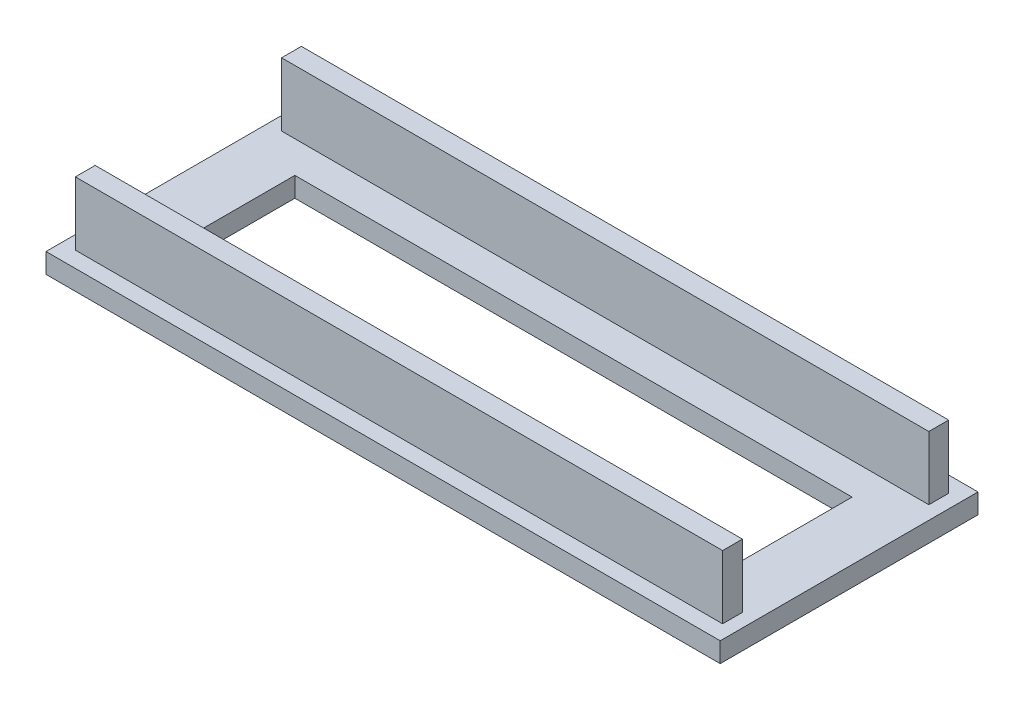
ISO-10303-21;
HEADER;
FILE_DESCRIPTION(('STEP AP214'),'2;1');
FILE_NAME('part.step','',(''),(''),'','','');
FILE_SCHEMA(('AUTOMOTIVE_DESIGN { 1 0 10303 214 1 1 1 1 }'));
ENDSEC;
DATA;
#1=APPLICATION_CONTEXT('core data for automotive mechanical design processes');
#2=APPLICATION_PROTOCOL_DEFINITION('international standard','automotive_design',2000,#1);
#3=PRODUCT_CONTEXT('',#1,'mechanical');
#4=PRODUCT('Part','Part','',(#3));
#5=PRODUCT_RELATED_PRODUCT_CATEGORY('part','',(#4));
#6=PRODUCT_DEFINITION_FORMATION('','',#4);
#7=PRODUCT_DEFINITION_CONTEXT('part definition',#1,'design');
#8=PRODUCT_DEFINITION('design','',#6,#7);
#9=PRODUCT_DEFINITION_SHAPE('','',#8);
#10=(LENGTH_UNIT() NAMED_UNIT(*) SI_UNIT(.MILLI.,.METRE.));
#11=(NAMED_UNIT(*) PLANE_ANGLE_UNIT() SI_UNIT($,.RADIAN.));
#12=(NAMED_UNIT(*) SI_UNIT($,.STERADIAN.) SOLID_ANGLE_UNIT());
#13=UNCERTAINTY_MEASURE_WITH_UNIT(LENGTH_MEASURE(1.E-05),#10,'distance_accuracy_value','');
#14=(GEOMETRIC_REPRESENTATION_CONTEXT(3) GLOBAL_UNCERTAINTY_ASSIGNED_CONTEXT((#13)) GLOBAL_UNIT_ASSIGNED_CONTEXT((#10,
#11,#12)) REPRESENTATION_CONTEXT('',''));
#15=CARTESIAN_POINT('',(0.,0.,0.));
#16=DIRECTION('',(0.,0.,1.));
#17=DIRECTION('',(1.,0.,0.));
#18=AXIS2_PLACEMENT_3D('',#15,#16,#17);
#19=CARTESIAN_POINT('',(0.,10.,0.));
#20=DIRECTION('',(0.,-1.,0.));
#21=DIRECTION('',(0.,0.,-1.));
#22=AXIS2_PLACEMENT_3D('',#19,#20,#21);
#23=PLANE('',#22);
#24=DIRECTION('',(0.,0.,-1.));
#25=VECTOR('',#24,1.);
#26=CARTESIAN_POINT('',(163.2,10.,0.));
#27=LINE('',#26,#25);
#28=CARTESIAN_POINT('',(163.2,10.,-47.));
#29=VERTEX_POINT('',#28);
#30=CARTESIAN_POINT('',(163.2,10.,-57.));
#31=VERTEX_POINT('',#30);
#32=EDGE_CURVE('E213',#29,#31,#27,.T.);
#33=ORIENTED_EDGE('',*,*,#32,.F.);
#34=DIRECTION('',(1.,0.,0.));
#35=VECTOR('',#34,1.);
#36=CARTESIAN_POINT('',(0.,10.,-47.));
#37=LINE('',#36,#35);
#38=CARTESIAN_POINT('',(-163.2,10.,-47.));
#39=VERTEX_POINT('',#38);
#40=EDGE_CURVE('E204',#39,#29,#37,.T.);
#41=ORIENTED_EDGE('',*,*,#40,.F.);
#42=DIRECTION('',(0.,0.,1.));
#43=VECTOR('',#42,1.);
#44=CARTESIAN_POINT('',(-163.2,10.,0.));
#45=LINE('',#44,#43);
#46=CARTESIAN_POINT('',(-163.2,10.,-57.));
#47=VERTEX_POINT('',#46);
#48=EDGE_CURVE('E207',#47,#39,#45,.T.);
#49=ORIENTED_EDGE('',*,*,#48,.F.);
#50=DIRECTION('',(-1.,0.,0.));
#51=VECTOR('',#50,1.);
#52=CARTESIAN_POINT('',(0.,10.,-57.));
#53=LINE('',#52,#51);
#54=EDGE_CURVE('E210',#31,#47,#53,.T.);
#55=ORIENTED_EDGE('',*,*,#54,.F.);
#56=EDGE_LOOP('',(#33,#41,#49,#55));
#57=FACE_BOUND('',#56,.T.);
#58=DIRECTION('',(0.,0.,-1.));
#59=VECTOR('',#58,1.);
#60=CARTESIAN_POINT('',(170.,10.,65.));
#61=LINE('',#60,#59);
#62=CARTESIAN_POINT('',(170.,10.,65.));
#63=VERTEX_POINT('',#62);
#64=CARTESIAN_POINT('',(170.,10.,-65.));
#65=VERTEX_POINT('',#64);
#66=EDGE_CURVE('E248',#63,#65,#61,.T.);
#67=ORIENTED_EDGE('',*,*,#66,.T.);
#68=DIRECTION('',(-1.,0.,0.));
#69=VECTOR('',#68,1.);
#70=CARTESIAN_POINT('',(-170.,10.,-65.));
#71=LINE('',#70,#69);
#72=CARTESIAN_POINT('',(-170.,10.,-65.));
#73=VERTEX_POINT('',#72);
#74=EDGE_CURVE('E251',#65,#73,#71,.T.);
#75=ORIENTED_EDGE('',*,*,#74,.T.);
#76=DIRECTION('',(0.,0.,1.));
#77=VECTOR('',#76,1.);
#78=CARTESIAN_POINT('',(-170.,10.,65.));
#79=LINE('',#78,#77);
#80=CARTESIAN_POINT('',(-170.,10.,65.));
#81=VERTEX_POINT('',#80);
#82=EDGE_CURVE('E254',#73,#81,#79,.T.);
#83=ORIENTED_EDGE('',*,*,#82,.T.);
#84=DIRECTION('',(1.,0.,0.));
#85=VECTOR('',#84,1.);
#86=CARTESIAN_POINT('',(-170.,10.,65.));
#87=LINE('',#86,#85);
#88=EDGE_CURVE('E256',#81,#63,#87,.T.);
#89=ORIENTED_EDGE('',*,*,#88,.T.);
#90=EDGE_LOOP('',(#67,#75,#83,#89));
#91=FACE_BOUND('',#90,.T.);
#92=DIRECTION('',(0.,0.,-1.));
#93=VECTOR('',#92,1.);
#94=CARTESIAN_POINT('',(140.5,10.,31.));
#95=LINE('',#94,#93);
#96=CARTESIAN_POINT('',(140.5,10.,31.));
#97=VERTEX_POINT('',#96);
#98=CARTESIAN_POINT('',(140.5,10.,-31.));
#99=VERTEX_POINT('',#98);
#100=EDGE_CURVE('E217',#97,#99,#95,.T.);
#101=ORIENTED_EDGE('',*,*,#100,.F.);
#102=DIRECTION('',(1.,0.,0.));
#103=VECTOR('',#102,1.);
#104=CARTESIAN_POINT('',(-140.5,10.,31.));
#105=LINE('',#104,#103);
#106=CARTESIAN_POINT('',(-140.5,10.,31.));
#107=VERTEX_POINT('',#106);
#108=EDGE_CURVE('E225',#107,#97,#105,.T.);
#109=ORIENTED_EDGE('',*,*,#108,.F.);
#110=DIRECTION('',(0.,0.,1.));
#111=VECTOR('',#110,1.);
#112=CARTESIAN_POINT('',(-140.5,10.,31.));
#113=LINE('',#112,#111);
#114=CARTESIAN_POINT('',(-140.5,10.,-31.));
#115=VERTEX_POINT('',#114);
#116=EDGE_CURVE('E222',#115,#107,#113,.T.);
#117=ORIENTED_EDGE('',*,*,#116,.F.);
#118=DIRECTION('',(-1.,0.,0.));
#119=VECTOR('',#118,1.);
#120=CARTESIAN_POINT('',(-140.5,10.,-31.));
#121=LINE('',#120,#119);
#122=EDGE_CURVE('E219',#99,#115,#121,.T.);
#123=ORIENTED_EDGE('',*,*,#122,.F.);
#124=EDGE_LOOP('',(#101,#109,#117,#123));
#125=FACE_BOUND('',#124,.T.);
#126=DIRECTION('',(0.,0.,-1.));
#127=VECTOR('',#126,1.);
#128=CARTESIAN_POINT('',(163.2,10.,0.));
#129=LINE('',#128,#127);
#130=CARTESIAN_POINT('',(163.2,10.,57.));
#131=VERTEX_POINT('',#130);
#132=CARTESIAN_POINT('',(163.2,10.,47.));
#133=VERTEX_POINT('',#132);
#134=EDGE_CURVE('E181',#131,#133,#129,.T.);
#135=ORIENTED_EDGE('',*,*,#134,.F.);
#136=DIRECTION('',(1.,0.,0.));
#137=VECTOR('',#136,1.);
#138=CARTESIAN_POINT('',(0.,10.,57.));
#139=LINE('',#138,#137);
#140=CARTESIAN_POINT('',(-163.2,10.,57.));
#141=VERTEX_POINT('',#140);
#142=EDGE_CURVE('E166',#141,#131,#139,.T.);
#143=ORIENTED_EDGE('',*,*,#142,.F.);
#144=DIRECTION('',(0.,0.,1.));
#145=VECTOR('',#144,1.);
#146=CARTESIAN_POINT('',(-163.2,10.,0.));
#147=LINE('',#146,#145);
#148=CARTESIAN_POINT('',(-163.2,10.,47.));
#149=VERTEX_POINT('',#148);
#150=EDGE_CURVE('E59',#149,#141,#147,.T.);
#151=ORIENTED_EDGE('',*,*,#150,.F.);
#152=DIRECTION('',(-1.,0.,0.));
#153=VECTOR('',#152,1.);
#154=CARTESIAN_POINT('',(0.,10.,47.));
#155=LINE('',#154,#153);
#156=EDGE_CURVE('E54',#133,#149,#155,.T.);
#157=ORIENTED_EDGE('',*,*,#156,.F.);
#158=EDGE_LOOP('',(#135,#143,#151,#157));
#159=FACE_BOUND('',#158,.T.);
#160=ADVANCED_FACE('F39',(#57,#91,#125,#159),#23,.F.);
#161=CARTESIAN_POINT('',(0.,0.,0.));
#162=DIRECTION('',(0.,-1.,0.));
#163=DIRECTION('',(0.,0.,-1.));
#164=AXIS2_PLACEMENT_3D('',#161,#162,#163);
#165=PLANE('',#164);
#166=DIRECTION('',(0.,0.,-1.));
#167=VECTOR('',#166,1.);
#168=CARTESIAN_POINT('',(170.,0.,65.));
#169=LINE('',#168,#167);
#170=CARTESIAN_POINT('',(170.,0.,65.));
#171=VERTEX_POINT('',#170);
#172=CARTESIAN_POINT('',(170.,0.,-65.));
#173=VERTEX_POINT('',#172);
#174=EDGE_CURVE('E247',#171,#173,#169,.T.);
#175=ORIENTED_EDGE('',*,*,#174,.F.);
#176=DIRECTION('',(1.,0.,0.));
#177=VECTOR('',#176,1.);
#178=CARTESIAN_POINT('',(-170.,0.,65.));
#179=LINE('',#178,#177);
#180=CARTESIAN_POINT('',(-170.,0.,65.));
#181=VERTEX_POINT('',#180);
#182=EDGE_CURVE('E252',#181,#171,#179,.T.);
#183=ORIENTED_EDGE('',*,*,#182,.F.);
#184=DIRECTION('',(0.,0.,1.));
#185=VECTOR('',#184,1.);
#186=CARTESIAN_POINT('',(-170.,0.,65.));
#187=LINE('',#186,#185);
#188=CARTESIAN_POINT('',(-170.,0.,-65.));
#189=VERTEX_POINT('',#188);
#190=EDGE_CURVE('E263',#189,#181,#187,.T.);
#191=ORIENTED_EDGE('',*,*,#190,.F.);
#192=DIRECTION('',(-1.,0.,0.));
#193=VECTOR('',#192,1.);
#194=CARTESIAN_POINT('',(-170.,0.,-65.));
#195=LINE('',#194,#193);
#196=EDGE_CURVE('E261',#173,#189,#195,.T.);
#197=ORIENTED_EDGE('',*,*,#196,.F.);
#198=EDGE_LOOP('',(#175,#183,#191,#197));
#199=FACE_BOUND('',#198,.T.);
#200=DIRECTION('',(1.,0.,0.));
#201=VECTOR('',#200,1.);
#202=CARTESIAN_POINT('',(-140.5,0.,31.));
#203=LINE('',#202,#201);
#204=CARTESIAN_POINT('',(-140.5,0.,31.));
#205=VERTEX_POINT('',#204);
#206=CARTESIAN_POINT('',(140.5,0.,31.));
#207=VERTEX_POINT('',#206);
#208=EDGE_CURVE('E220',#205,#207,#203,.T.);
#209=ORIENTED_EDGE('',*,*,#208,.T.);
#210=DIRECTION('',(0.,0.,-1.));
#211=VECTOR('',#210,1.);
#212=CARTESIAN_POINT('',(140.5,0.,31.));
#213=LINE('',#212,#211);
#214=CARTESIAN_POINT('',(140.5,0.,-31.));
#215=VERTEX_POINT('',#214);
#216=EDGE_CURVE('E216',#207,#215,#213,.T.);
#217=ORIENTED_EDGE('',*,*,#216,.T.);
#218=DIRECTION('',(-1.,0.,0.));
#219=VECTOR('',#218,1.);
#220=CARTESIAN_POINT('',(-140.5,0.,-31.));
#221=LINE('',#220,#219);
#222=CARTESIAN_POINT('',(-140.5,0.,-31.));
#223=VERTEX_POINT('',#222);
#224=EDGE_CURVE('E230',#215,#223,#221,.T.);
#225=ORIENTED_EDGE('',*,*,#224,.T.);
#226=DIRECTION('',(0.,0.,1.));
#227=VECTOR('',#226,1.);
#228=CARTESIAN_POINT('',(-140.5,0.,31.));
#229=LINE('',#228,#227);
#230=EDGE_CURVE('E233',#223,#205,#229,.T.);
#231=ORIENTED_EDGE('',*,*,#230,.T.);
#232=EDGE_LOOP('',(#209,#217,#225,#231));
#233=FACE_BOUND('',#232,.T.);
#234=ADVANCED_FACE('F281',(#199,#233),#165,.T.);
#235=CARTESIAN_POINT('',(170.,10.,65.));
#236=DIRECTION('',(-1.,0.,0.));
#237=DIRECTION('',(0.,0.,1.));
#238=AXIS2_PLACEMENT_3D('',#235,#236,#237);
#239=PLANE('',#238);
#240=ORIENTED_EDGE('',*,*,#174,.T.);
#241=DIRECTION('',(0.,-1.,0.));
#242=VECTOR('',#241,1.);
#243=CARTESIAN_POINT('',(170.,10.,-65.));
#244=LINE('',#243,#242);
#245=EDGE_CURVE('E11',#65,#173,#244,.T.);
#246=ORIENTED_EDGE('',*,*,#245,.F.);
#247=ORIENTED_EDGE('',*,*,#66,.F.);
#248=DIRECTION('',(0.,-1.,0.));
#249=VECTOR('',#248,1.);
#250=CARTESIAN_POINT('',(170.,10.,65.));
#251=LINE('',#250,#249);
#252=EDGE_CURVE('E258',#63,#171,#251,.T.);
#253=ORIENTED_EDGE('',*,*,#252,.T.);
#254=EDGE_LOOP('',(#240,#246,#247,#253));
#255=FACE_BOUND('',#254,.T.);
#256=ADVANCED_FACE('F41',(#255),#239,.F.);
#257=CARTESIAN_POINT('',(-170.,10.,-65.));
#258=DIRECTION('',(0.,0.,1.));
#259=DIRECTION('',(1.,0.,0.));
#260=AXIS2_PLACEMENT_3D('',#257,#258,#259);
#261=PLANE('',#260);
#262=ORIENTED_EDGE('',*,*,#196,.T.);
#263=DIRECTION('',(0.,-1.,0.));
#264=VECTOR('',#263,1.);
#265=CARTESIAN_POINT('',(-170.,10.,-65.));
#266=LINE('',#265,#264);
#267=EDGE_CURVE('E47',#73,#189,#266,.T.);
#268=ORIENTED_EDGE('',*,*,#267,.F.);
#269=ORIENTED_EDGE('',*,*,#74,.F.);
#270=ORIENTED_EDGE('',*,*,#245,.T.);
#271=EDGE_LOOP('',(#262,#268,#269,#270));
#272=FACE_BOUND('',#271,.T.);
#273=ADVANCED_FACE('F292',(#272),#261,.F.);
#274=CARTESIAN_POINT('',(-170.,10.,65.));
#275=DIRECTION('',(1.,0.,0.));
#276=DIRECTION('',(0.,0.,-1.));
#277=AXIS2_PLACEMENT_3D('',#274,#275,#276);
#278=PLANE('',#277);
#279=ORIENTED_EDGE('',*,*,#190,.T.);
#280=DIRECTION('',(0.,-1.,0.));
#281=VECTOR('',#280,1.);
#282=CARTESIAN_POINT('',(-170.,10.,65.));
#283=LINE('',#282,#281);
#284=EDGE_CURVE('E268',#81,#181,#283,.T.);
#285=ORIENTED_EDGE('',*,*,#284,.F.);
#286=ORIENTED_EDGE('',*,*,#82,.F.);
#287=ORIENTED_EDGE('',*,*,#267,.T.);
#288=EDGE_LOOP('',(#279,#285,#286,#287));
#289=FACE_BOUND('',#288,.T.);
#290=ADVANCED_FACE('F275',(#289),#278,.F.);
#291=CARTESIAN_POINT('',(-170.,10.,65.));
#292=DIRECTION('',(0.,0.,-1.));
#293=DIRECTION('',(-1.,0.,0.));
#294=AXIS2_PLACEMENT_3D('',#291,#292,#293);
#295=PLANE('',#294);
#296=ORIENTED_EDGE('',*,*,#182,.T.);
#297=ORIENTED_EDGE('',*,*,#252,.F.);
#298=ORIENTED_EDGE('',*,*,#88,.F.);
#299=ORIENTED_EDGE('',*,*,#284,.T.);
#300=EDGE_LOOP('',(#296,#297,#298,#299));
#301=FACE_BOUND('',#300,.T.);
#302=ADVANCED_FACE('F285',(#301),#295,.F.);
#303=CARTESIAN_POINT('',(140.5,10.,31.));
#304=DIRECTION('',(-1.,0.,0.));
#305=DIRECTION('',(0.,0.,1.));
#306=AXIS2_PLACEMENT_3D('',#303,#304,#305);
#307=PLANE('',#306);
#308=ORIENTED_EDGE('',*,*,#216,.F.);
#309=DIRECTION('',(0.,-1.,0.));
#310=VECTOR('',#309,1.);
#311=CARTESIAN_POINT('',(140.5,10.,31.));
#312=LINE('',#311,#310);
#313=EDGE_CURVE('E227',#97,#207,#312,.T.);
#314=ORIENTED_EDGE('',*,*,#313,.F.);
#315=ORIENTED_EDGE('',*,*,#100,.T.);
#316=DIRECTION('',(0.,-1.,0.));
#317=VECTOR('',#316,1.);
#318=CARTESIAN_POINT('',(140.5,10.,-31.));
#319=LINE('',#318,#317);
#320=EDGE_CURVE('E244',#99,#215,#319,.T.);
#321=ORIENTED_EDGE('',*,*,#320,.T.);
#322=EDGE_LOOP('',(#308,#314,#315,#321));
#323=FACE_BOUND('',#322,.T.);
#324=ADVANCED_FACE('F307',(#323),#307,.T.);
#325=CARTESIAN_POINT('',(-140.5,10.,-31.));
#326=DIRECTION('',(0.,0.,1.));
#327=DIRECTION('',(1.,0.,0.));
#328=AXIS2_PLACEMENT_3D('',#325,#326,#327);
#329=PLANE('',#328);
#330=ORIENTED_EDGE('',*,*,#224,.F.);
#331=ORIENTED_EDGE('',*,*,#320,.F.);
#332=ORIENTED_EDGE('',*,*,#122,.T.);
#333=DIRECTION('',(0.,-1.,0.));
#334=VECTOR('',#333,1.);
#335=CARTESIAN_POINT('',(-140.5,10.,-31.));
#336=LINE('',#335,#334);
#337=EDGE_CURVE('E242',#115,#223,#336,.T.);
#338=ORIENTED_EDGE('',*,*,#337,.T.);
#339=EDGE_LOOP('',(#330,#331,#332,#338));
#340=FACE_BOUND('',#339,.T.);
#341=ADVANCED_FACE('F314',(#340),#329,.T.);
#342=CARTESIAN_POINT('',(-140.5,10.,31.));
#343=DIRECTION('',(1.,0.,0.));
#344=DIRECTION('',(0.,0.,-1.));
#345=AXIS2_PLACEMENT_3D('',#342,#343,#344);
#346=PLANE('',#345);
#347=ORIENTED_EDGE('',*,*,#230,.F.);
#348=ORIENTED_EDGE('',*,*,#337,.F.);
#349=ORIENTED_EDGE('',*,*,#116,.T.);
#350=DIRECTION('',(0.,-1.,0.));
#351=VECTOR('',#350,1.);
#352=CARTESIAN_POINT('',(-140.5,10.,31.));
#353=LINE('',#352,#351);
#354=EDGE_CURVE('E240',#107,#205,#353,.T.);
#355=ORIENTED_EDGE('',*,*,#354,.T.);
#356=EDGE_LOOP('',(#347,#348,#349,#355));
#357=FACE_BOUND('',#356,.T.);
#358=ADVANCED_FACE('F319',(#357),#346,.T.);
#359=CARTESIAN_POINT('',(-140.5,10.,31.));
#360=DIRECTION('',(0.,0.,-1.));
#361=DIRECTION('',(-1.,0.,0.));
#362=AXIS2_PLACEMENT_3D('',#359,#360,#361);
#363=PLANE('',#362);
#364=ORIENTED_EDGE('',*,*,#208,.F.);
#365=ORIENTED_EDGE('',*,*,#354,.F.);
#366=ORIENTED_EDGE('',*,*,#108,.T.);
#367=ORIENTED_EDGE('',*,*,#313,.T.);
#368=EDGE_LOOP('',(#364,#365,#366,#367));
#369=FACE_BOUND('',#368,.T.);
#370=ADVANCED_FACE('F326',(#369),#363,.T.);
#371=CARTESIAN_POINT('',(163.2,42.,-47.));
#372=DIRECTION('',(-1.,0.,0.));
#373=DIRECTION('',(0.,0.,1.));
#374=AXIS2_PLACEMENT_3D('',#371,#372,#373);
#375=PLANE('',#374);
#376=DIRECTION('',(0.,-1.,0.));
#377=VECTOR('',#376,1.);
#378=CARTESIAN_POINT('',(163.2,42.,-47.));
#379=LINE('',#378,#377);
#380=CARTESIAN_POINT('',(163.2,42.,-47.));
#381=VERTEX_POINT('',#380);
#382=EDGE_CURVE('E192',#381,#29,#379,.T.);
#383=ORIENTED_EDGE('',*,*,#382,.T.);
#384=ORIENTED_EDGE('',*,*,#32,.T.);
#385=DIRECTION('',(0.,-1.,0.));
#386=VECTOR('',#385,1.);
#387=CARTESIAN_POINT('',(163.2,42.,-57.));
#388=LINE('',#387,#386);
#389=CARTESIAN_POINT('',(163.2,42.,-57.));
#390=VERTEX_POINT('',#389);
#391=EDGE_CURVE('E201',#390,#31,#388,.T.);
#392=ORIENTED_EDGE('',*,*,#391,.F.);
#393=DIRECTION('',(0.,0.,-1.));
#394=VECTOR('',#393,1.);
#395=CARTESIAN_POINT('',(163.2,42.,-47.));
#396=LINE('',#395,#394);
#397=EDGE_CURVE('E183',#381,#390,#396,.T.);
#398=ORIENTED_EDGE('',*,*,#397,.F.);
#399=EDGE_LOOP('',(#383,#384,#392,#398));
#400=FACE_BOUND('',#399,.T.);
#401=ADVANCED_FACE('F370',(#400),#375,.F.);
#402=CARTESIAN_POINT('',(-163.2,42.,-57.));
#403=DIRECTION('',(0.,0.,1.));
#404=DIRECTION('',(1.,0.,0.));
#405=AXIS2_PLACEMENT_3D('',#402,#403,#404);
#406=PLANE('',#405);
#407=ORIENTED_EDGE('',*,*,#391,.T.);
#408=ORIENTED_EDGE('',*,*,#54,.T.);
#409=DIRECTION('',(0.,-1.,0.));
#410=VECTOR('',#409,1.);
#411=CARTESIAN_POINT('',(-163.2,42.,-57.));
#412=LINE('',#411,#410);
#413=CARTESIAN_POINT('',(-163.2,42.,-57.));
#414=VERTEX_POINT('',#413);
#415=EDGE_CURVE('E198',#414,#47,#412,.T.);
#416=ORIENTED_EDGE('',*,*,#415,.F.);
#417=DIRECTION('',(-1.,0.,0.));
#418=VECTOR('',#417,1.);
#419=CARTESIAN_POINT('',(-163.2,42.,-57.));
#420=LINE('',#419,#418);
#421=EDGE_CURVE('E186',#390,#414,#420,.T.);
#422=ORIENTED_EDGE('',*,*,#421,.F.);
#423=EDGE_LOOP('',(#407,#408,#416,#422));
#424=FACE_BOUND('',#423,.T.);
#425=ADVANCED_FACE('F366',(#424),#406,.F.);
#426=CARTESIAN_POINT('',(-163.2,42.,-47.));
#427=DIRECTION('',(1.,0.,0.));
#428=DIRECTION('',(0.,0.,-1.));
#429=AXIS2_PLACEMENT_3D('',#426,#427,#428);
#430=PLANE('',#429);
#431=ORIENTED_EDGE('',*,*,#415,.T.);
#432=ORIENTED_EDGE('',*,*,#48,.T.);
#433=DIRECTION('',(0.,-1.,0.));
#434=VECTOR('',#433,1.);
#435=CARTESIAN_POINT('',(-163.2,42.,-47.));
#436=LINE('',#435,#434);
#437=CARTESIAN_POINT('',(-163.2,42.,-47.));
#438=VERTEX_POINT('',#437);
#439=EDGE_CURVE('E195',#438,#39,#436,.T.);
#440=ORIENTED_EDGE('',*,*,#439,.F.);
#441=DIRECTION('',(0.,0.,1.));
#442=VECTOR('',#441,1.);
#443=CARTESIAN_POINT('',(-163.2,42.,-47.));
#444=LINE('',#443,#442);
#445=EDGE_CURVE('E188',#414,#438,#444,.T.);
#446=ORIENTED_EDGE('',*,*,#445,.F.);
#447=EDGE_LOOP('',(#431,#432,#440,#446));
#448=FACE_BOUND('',#447,.T.);
#449=ADVANCED_FACE('F362',(#448),#430,.F.);
#450=CARTESIAN_POINT('',(-163.2,42.,-47.));
#451=DIRECTION('',(0.,0.,-1.));
#452=DIRECTION('',(-1.,0.,0.));
#453=AXIS2_PLACEMENT_3D('',#450,#451,#452);
#454=PLANE('',#453);
#455=ORIENTED_EDGE('',*,*,#439,.T.);
#456=ORIENTED_EDGE('',*,*,#40,.T.);
#457=ORIENTED_EDGE('',*,*,#382,.F.);
#458=DIRECTION('',(1.,0.,0.));
#459=VECTOR('',#458,1.);
#460=CARTESIAN_POINT('',(-163.2,42.,-47.));
#461=LINE('',#460,#459);
#462=EDGE_CURVE('E190',#438,#381,#461,.T.);
#463=ORIENTED_EDGE('',*,*,#462,.F.);
#464=EDGE_LOOP('',(#455,#456,#457,#463));
#465=FACE_BOUND('',#464,.T.);
#466=ADVANCED_FACE('F358',(#465),#454,.F.);
#467=CARTESIAN_POINT('',(0.,42.,0.));
#468=DIRECTION('',(0.,-1.,0.));
#469=DIRECTION('',(0.,0.,-1.));
#470=AXIS2_PLACEMENT_3D('',#467,#468,#469);
#471=PLANE('',#470);
#472=ORIENTED_EDGE('',*,*,#397,.T.);
#473=ORIENTED_EDGE('',*,*,#421,.T.);
#474=ORIENTED_EDGE('',*,*,#445,.T.);
#475=ORIENTED_EDGE('',*,*,#462,.T.);
#476=EDGE_LOOP('',(#472,#473,#474,#475));
#477=FACE_BOUND('',#476,.T.);
#478=ADVANCED_FACE('F355',(#477),#471,.F.);
#479=CARTESIAN_POINT('',(163.2,42.,57.));
#480=DIRECTION('',(-1.,0.,0.));
#481=DIRECTION('',(0.,0.,1.));
#482=AXIS2_PLACEMENT_3D('',#479,#480,#481);
#483=PLANE('',#482);
#484=DIRECTION('',(0.,-1.,0.));
#485=VECTOR('',#484,1.);
#486=CARTESIAN_POINT('',(163.2,42.,57.));
#487=LINE('',#486,#485);
#488=CARTESIAN_POINT('',(163.2,42.,57.));
#489=VERTEX_POINT('',#488);
#490=EDGE_CURVE('E161',#489,#131,#487,.T.);
#491=ORIENTED_EDGE('',*,*,#490,.T.);
#492=ORIENTED_EDGE('',*,*,#134,.T.);
#493=DIRECTION('',(0.,-1.,0.));
#494=VECTOR('',#493,1.);
#495=CARTESIAN_POINT('',(163.2,42.,47.));
#496=LINE('',#495,#494);
#497=CARTESIAN_POINT('',(163.2,42.,47.));
#498=VERTEX_POINT('',#497);
#499=EDGE_CURVE('E172',#498,#133,#496,.T.);
#500=ORIENTED_EDGE('',*,*,#499,.F.);
#501=DIRECTION('',(0.,0.,-1.));
#502=VECTOR('',#501,1.);
#503=CARTESIAN_POINT('',(163.2,42.,57.));
#504=LINE('',#503,#502);
#505=EDGE_CURVE('E154',#489,#498,#504,.T.);
#506=ORIENTED_EDGE('',*,*,#505,.F.);
#507=EDGE_LOOP('',(#491,#492,#500,#506));
#508=FACE_BOUND('',#507,.T.);
#509=ADVANCED_FACE('F170',(#508),#483,.F.);
#510=CARTESIAN_POINT('',(-163.2,42.,47.));
#511=DIRECTION('',(0.,0.,1.));
#512=DIRECTION('',(1.,0.,0.));
#513=AXIS2_PLACEMENT_3D('',#510,#511,#512);
#514=PLANE('',#513);
#515=ORIENTED_EDGE('',*,*,#499,.T.);
#516=ORIENTED_EDGE('',*,*,#156,.T.);
#517=DIRECTION('',(0.,-1.,0.));
#518=VECTOR('',#517,1.);
#519=CARTESIAN_POINT('',(-163.2,42.,47.));
#520=LINE('',#519,#518);
#521=CARTESIAN_POINT('',(-163.2,42.,47.));
#522=VERTEX_POINT('',#521);
#523=EDGE_CURVE('E337',#522,#149,#520,.T.);
#524=ORIENTED_EDGE('',*,*,#523,.F.);
#525=DIRECTION('',(-1.,0.,0.));
#526=VECTOR('',#525,1.);
#527=CARTESIAN_POINT('',(-163.2,42.,47.));
#528=LINE('',#527,#526);
#529=EDGE_CURVE('E173',#498,#522,#528,.T.);
#530=ORIENTED_EDGE('',*,*,#529,.F.);
#531=EDGE_LOOP('',(#515,#516,#524,#530));
#532=FACE_BOUND('',#531,.T.);
#533=ADVANCED_FACE('F334',(#532),#514,.F.);
#534=CARTESIAN_POINT('',(-163.2,42.,57.));
#535=DIRECTION('',(1.,0.,0.));
#536=DIRECTION('',(0.,0.,-1.));
#537=AXIS2_PLACEMENT_3D('',#534,#535,#536);
#538=PLANE('',#537);
#539=ORIENTED_EDGE('',*,*,#523,.T.);
#540=ORIENTED_EDGE('',*,*,#150,.T.);
#541=DIRECTION('',(0.,-1.,0.));
#542=VECTOR('',#541,1.);
#543=CARTESIAN_POINT('',(-163.2,42.,57.));
#544=LINE('',#543,#542);
#545=CARTESIAN_POINT('',(-163.2,42.,57.));
#546=VERTEX_POINT('',#545);
#547=EDGE_CURVE('E168',#546,#141,#544,.T.);
#548=ORIENTED_EDGE('',*,*,#547,.F.);
#549=DIRECTION('',(0.,0.,1.));
#550=VECTOR('',#549,1.);
#551=CARTESIAN_POINT('',(-163.2,42.,57.));
#552=LINE('',#551,#550);
#553=EDGE_CURVE('E157',#522,#546,#552,.T.);
#554=ORIENTED_EDGE('',*,*,#553,.F.);
#555=EDGE_LOOP('',(#539,#540,#548,#554));
#556=FACE_BOUND('',#555,.T.);
#557=ADVANCED_FACE('F342',(#556),#538,.F.);
#558=CARTESIAN_POINT('',(-163.2,42.,57.));
#559=DIRECTION('',(0.,0.,-1.));
#560=DIRECTION('',(-1.,0.,0.));
#561=AXIS2_PLACEMENT_3D('',#558,#559,#560);
#562=PLANE('',#561);
#563=ORIENTED_EDGE('',*,*,#547,.T.);
#564=ORIENTED_EDGE('',*,*,#142,.T.);
#565=ORIENTED_EDGE('',*,*,#490,.F.);
#566=DIRECTION('',(1.,0.,0.));
#567=VECTOR('',#566,1.);
#568=CARTESIAN_POINT('',(-163.2,42.,57.));
#569=LINE('',#568,#567);
#570=EDGE_CURVE('E150',#546,#489,#569,.T.);
#571=ORIENTED_EDGE('',*,*,#570,.F.);
#572=EDGE_LOOP('',(#563,#564,#565,#571));
#573=FACE_BOUND('',#572,.T.);
#574=ADVANCED_FACE('F165',(#573),#562,.F.);
#575=CARTESIAN_POINT('',(0.,42.,0.));
#576=DIRECTION('',(0.,-1.,0.));
#577=DIRECTION('',(0.,0.,-1.));
#578=AXIS2_PLACEMENT_3D('',#575,#576,#577);
#579=PLANE('',#578);
#580=ORIENTED_EDGE('',*,*,#505,.T.);
#581=ORIENTED_EDGE('',*,*,#529,.T.);
#582=ORIENTED_EDGE('',*,*,#553,.T.);
#583=ORIENTED_EDGE('',*,*,#570,.T.);
#584=EDGE_LOOP('',(#580,#581,#582,#583));
#585=FACE_BOUND('',#584,.T.);
#586=ADVANCED_FACE('F152',(#585),#579,.F.);
#587=CLOSED_SHELL('',(#160,#234,#256,#273,#290,#302,#324,#341,#358,#370,#401,#425,#449,#466,
#478,#509,#533,#557,#574,#586));
#588=MANIFOLD_SOLID_BREP('B2',#587);
#589=ADVANCED_BREP_SHAPE_REPRESENTATION('',(#18,#588),#14);
#590=SHAPE_DEFINITION_REPRESENTATION(#9,#589);
ENDSEC;
END-ISO-10303-21;
